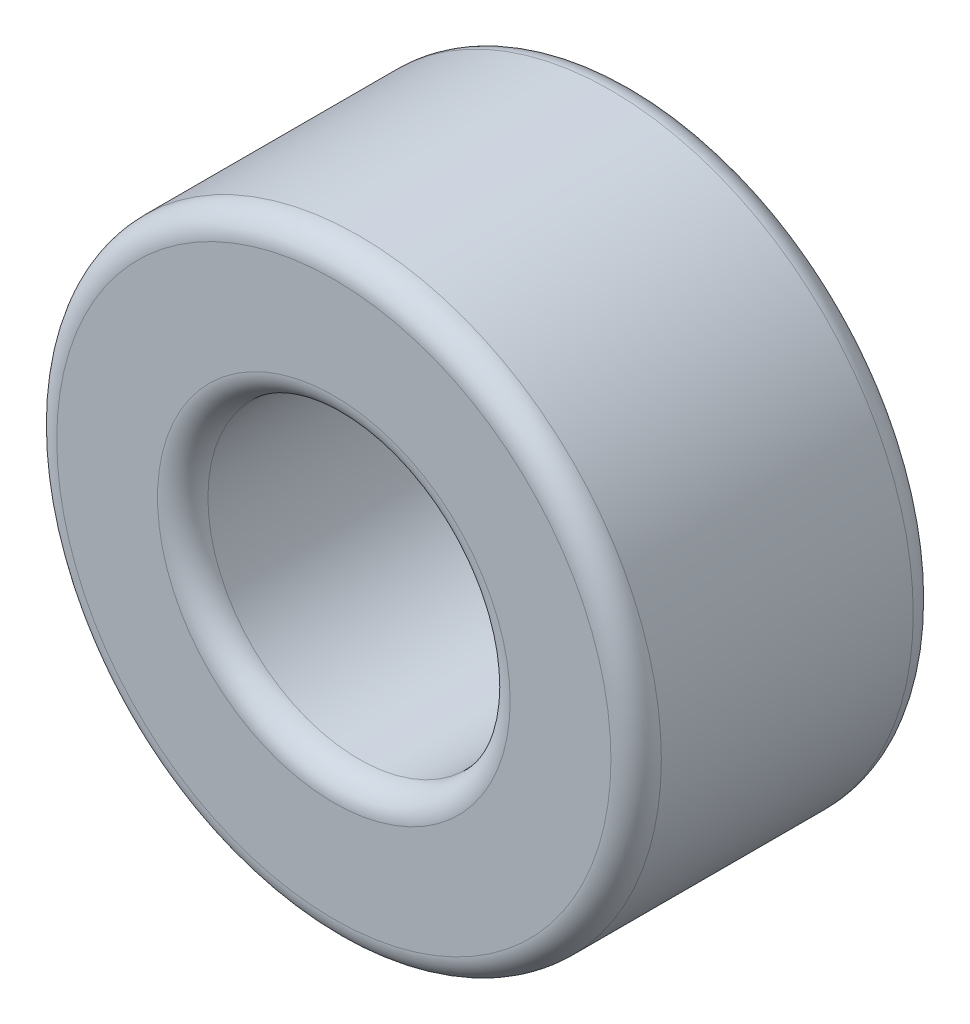
ISO-10303-21;
HEADER;
FILE_DESCRIPTION(('STEP AP214'),'2;1');
FILE_NAME('part.step','',(''),(''),'','','');
FILE_SCHEMA(('AUTOMOTIVE_DESIGN { 1 0 10303 214 1 1 1 1 }'));
ENDSEC;
DATA;
#1=APPLICATION_CONTEXT('core data for automotive mechanical design processes');
#2=APPLICATION_PROTOCOL_DEFINITION('international standard','automotive_design',2000,#1);
#3=PRODUCT_CONTEXT('',#1,'mechanical');
#4=PRODUCT('Part','Part','',(#3));
#5=PRODUCT_RELATED_PRODUCT_CATEGORY('part','',(#4));
#6=PRODUCT_DEFINITION_FORMATION('','',#4);
#7=PRODUCT_DEFINITION_CONTEXT('part definition',#1,'design');
#8=PRODUCT_DEFINITION('design','',#6,#7);
#9=PRODUCT_DEFINITION_SHAPE('','',#8);
#10=(LENGTH_UNIT() NAMED_UNIT(*) SI_UNIT(.MILLI.,.METRE.));
#11=(NAMED_UNIT(*) PLANE_ANGLE_UNIT() SI_UNIT($,.RADIAN.));
#12=(NAMED_UNIT(*) SI_UNIT($,.STERADIAN.) SOLID_ANGLE_UNIT());
#13=UNCERTAINTY_MEASURE_WITH_UNIT(LENGTH_MEASURE(1.E-05),#10,'distance_accuracy_value','');
#14=(GEOMETRIC_REPRESENTATION_CONTEXT(3) GLOBAL_UNCERTAINTY_ASSIGNED_CONTEXT((#13)) GLOBAL_UNIT_ASSIGNED_CONTEXT((#10,
#11,#12)) REPRESENTATION_CONTEXT('',''));
#15=CARTESIAN_POINT('',(0.,0.,0.));
#16=DIRECTION('',(0.,0.,1.));
#17=DIRECTION('',(1.,0.,0.));
#18=AXIS2_PLACEMENT_3D('',#15,#16,#17);
#19=CARTESIAN_POINT('',(0.,0.,6.));
#20=DIRECTION('',(0.,0.,1.));
#21=DIRECTION('',(1.,0.,0.));
#22=AXIS2_PLACEMENT_3D('',#19,#20,#21);
#23=PLANE('',#22);
#24=CARTESIAN_POINT('',(0.,0.,6.));
#25=DIRECTION('',(0.,0.,1.));
#26=DIRECTION('',(1.,0.,0.));
#27=AXIS2_PLACEMENT_3D('',#24,#25,#26);
#28=CIRCLE('',#27,3.5);
#29=CARTESIAN_POINT('',(3.5,0.,6.));
#30=VERTEX_POINT('',#29);
#31=EDGE_CURVE('E10',#30,#30,#28,.F.);
#32=ORIENTED_EDGE('',*,*,#31,.T.);
#33=EDGE_LOOP('',(#32));
#34=FACE_BOUND('',#33,.T.);
#35=CARTESIAN_POINT('',(0.,0.,6.));
#36=DIRECTION('',(0.,0.,1.));
#37=DIRECTION('',(1.,0.,0.));
#38=AXIS2_PLACEMENT_3D('',#35,#36,#37);
#39=CIRCLE('',#38,5.5);
#40=CARTESIAN_POINT('',(5.5,0.,6.));
#41=VERTEX_POINT('',#40);
#42=EDGE_CURVE('E41',#41,#41,#39,.T.);
#43=ORIENTED_EDGE('',*,*,#42,.T.);
#44=EDGE_LOOP('',(#43));
#45=FACE_BOUND('',#44,.T.);
#46=ADVANCED_FACE('F34',(#34,#45),#23,.T.);
#47=CARTESIAN_POINT('',(0.,0.,0.));
#48=DIRECTION('',(0.,0.,1.));
#49=DIRECTION('',(1.,0.,0.));
#50=AXIS2_PLACEMENT_3D('',#47,#48,#49);
#51=PLANE('',#50);
#52=CARTESIAN_POINT('',(0.,0.,0.));
#53=DIRECTION('',(0.,0.,1.));
#54=DIRECTION('',(1.,0.,0.));
#55=AXIS2_PLACEMENT_3D('',#52,#53,#54);
#56=CIRCLE('',#55,5.5);
#57=CARTESIAN_POINT('',(5.5,0.,0.));
#58=VERTEX_POINT('',#57);
#59=EDGE_CURVE('E54',#58,#58,#56,.F.);
#60=ORIENTED_EDGE('',*,*,#59,.T.);
#61=EDGE_LOOP('',(#60));
#62=FACE_BOUND('',#61,.T.);
#63=CARTESIAN_POINT('',(0.,0.,0.));
#64=DIRECTION('',(0.,0.,1.));
#65=DIRECTION('',(1.,0.,0.));
#66=AXIS2_PLACEMENT_3D('',#63,#64,#65);
#67=CIRCLE('',#66,3.5);
#68=CARTESIAN_POINT('',(3.5,0.,0.));
#69=VERTEX_POINT('',#68);
#70=EDGE_CURVE('E57',#69,#69,#67,.T.);
#71=ORIENTED_EDGE('',*,*,#70,.T.);
#72=EDGE_LOOP('',(#71));
#73=FACE_BOUND('',#72,.T.);
#74=ADVANCED_FACE('F78',(#62,#73),#51,.F.);
#75=CARTESIAN_POINT('',(0.,0.,6.));
#76=DIRECTION('',(0.,0.,-1.));
#77=DIRECTION('',(-1.,0.,0.));
#78=AXIS2_PLACEMENT_3D('',#75,#76,#77);
#79=CYLINDRICAL_SURFACE('',#78,6.);
#80=CARTESIAN_POINT('',(0.,0.,0.5));
#81=DIRECTION('',(0.,0.,1.));
#82=DIRECTION('',(1.,0.,0.));
#83=AXIS2_PLACEMENT_3D('',#80,#81,#82);
#84=CIRCLE('',#83,6.);
#85=CARTESIAN_POINT('',(6.,0.,0.5));
#86=VERTEX_POINT('',#85);
#87=EDGE_CURVE('E60',#86,#86,#84,.T.);
#88=ORIENTED_EDGE('',*,*,#87,.T.);
#89=EDGE_LOOP('',(#88));
#90=FACE_BOUND('',#89,.T.);
#91=CARTESIAN_POINT('',(0.,0.,5.5));
#92=DIRECTION('',(0.,0.,1.));
#93=DIRECTION('',(1.,0.,0.));
#94=AXIS2_PLACEMENT_3D('',#91,#92,#93);
#95=CIRCLE('',#94,6.);
#96=CARTESIAN_POINT('',(6.,0.,5.5));
#97=VERTEX_POINT('',#96);
#98=EDGE_CURVE('E63',#97,#97,#95,.F.);
#99=ORIENTED_EDGE('',*,*,#98,.T.);
#100=EDGE_LOOP('',(#99));
#101=FACE_BOUND('',#100,.T.);
#102=ADVANCED_FACE('F67',(#90,#101),#79,.T.);
#103=CARTESIAN_POINT('',(0.,0.,6.));
#104=DIRECTION('',(0.,0.,-1.));
#105=DIRECTION('',(-1.,0.,0.));
#106=AXIS2_PLACEMENT_3D('',#103,#104,#105);
#107=CYLINDRICAL_SURFACE('',#106,3.);
#108=CARTESIAN_POINT('',(0.,0.,0.5));
#109=DIRECTION('',(0.,0.,1.));
#110=DIRECTION('',(1.,0.,0.));
#111=AXIS2_PLACEMENT_3D('',#108,#109,#110);
#112=CIRCLE('',#111,3.);
#113=CARTESIAN_POINT('',(3.,0.,0.5));
#114=VERTEX_POINT('',#113);
#115=EDGE_CURVE('E45',#114,#114,#112,.F.);
#116=ORIENTED_EDGE('',*,*,#115,.T.);
#117=EDGE_LOOP('',(#116));
#118=FACE_BOUND('',#117,.T.);
#119=CARTESIAN_POINT('',(0.,0.,5.5));
#120=DIRECTION('',(0.,0.,1.));
#121=DIRECTION('',(1.,0.,0.));
#122=AXIS2_PLACEMENT_3D('',#119,#120,#121);
#123=CIRCLE('',#122,3.);
#124=CARTESIAN_POINT('',(3.,0.,5.5));
#125=VERTEX_POINT('',#124);
#126=EDGE_CURVE('E49',#125,#125,#123,.T.);
#127=ORIENTED_EDGE('',*,*,#126,.T.);
#128=EDGE_LOOP('',(#127));
#129=FACE_BOUND('',#128,.T.);
#130=ADVANCED_FACE('F86',(#118,#129),#107,.F.);
#131=CARTESIAN_POINT('',(0.,0.,0.5));
#132=DIRECTION('',(0.,0.,1.));
#133=DIRECTION('',(1.,0.,0.));
#134=AXIS2_PLACEMENT_3D('',#131,#132,#133);
#135=TOROIDAL_SURFACE('',#134,5.5,0.5);
#136=ORIENTED_EDGE('',*,*,#59,.F.);
#137=EDGE_LOOP('',(#136));
#138=FACE_BOUND('',#137,.T.);
#139=ORIENTED_EDGE('',*,*,#87,.F.);
#140=EDGE_LOOP('',(#139));
#141=FACE_BOUND('',#140,.T.);
#142=ADVANCED_FACE('F91',(#138,#141),#135,.T.);
#143=CARTESIAN_POINT('',(0.,0.,0.5));
#144=DIRECTION('',(0.,0.,1.));
#145=DIRECTION('',(1.,0.,0.));
#146=AXIS2_PLACEMENT_3D('',#143,#144,#145);
#147=TOROIDAL_SURFACE('',#146,3.5,0.5);
#148=ORIENTED_EDGE('',*,*,#115,.F.);
#149=EDGE_LOOP('',(#148));
#150=FACE_BOUND('',#149,.T.);
#151=ORIENTED_EDGE('',*,*,#70,.F.);
#152=EDGE_LOOP('',(#151));
#153=FACE_BOUND('',#152,.T.);
#154=ADVANCED_FACE('F75',(#150,#153),#147,.T.);
#155=CARTESIAN_POINT('',(0.,0.,5.5));
#156=DIRECTION('',(0.,0.,1.));
#157=DIRECTION('',(1.,0.,0.));
#158=AXIS2_PLACEMENT_3D('',#155,#156,#157);
#159=TOROIDAL_SURFACE('',#158,3.5,0.5);
#160=ORIENTED_EDGE('',*,*,#31,.F.);
#161=EDGE_LOOP('',(#160));
#162=FACE_BOUND('',#161,.T.);
#163=ORIENTED_EDGE('',*,*,#126,.F.);
#164=EDGE_LOOP('',(#163));
#165=FACE_BOUND('',#164,.T.);
#166=ADVANCED_FACE('F71',(#162,#165),#159,.T.);
#167=CARTESIAN_POINT('',(0.,0.,5.5));
#168=DIRECTION('',(0.,0.,1.));
#169=DIRECTION('',(1.,0.,0.));
#170=AXIS2_PLACEMENT_3D('',#167,#168,#169);
#171=TOROIDAL_SURFACE('',#170,5.5,0.5);
#172=ORIENTED_EDGE('',*,*,#98,.F.);
#173=EDGE_LOOP('',(#172));
#174=FACE_BOUND('',#173,.T.);
#175=ORIENTED_EDGE('',*,*,#42,.F.);
#176=EDGE_LOOP('',(#175));
#177=FACE_BOUND('',#176,.T.);
#178=ADVANCED_FACE('F36',(#174,#177),#171,.T.);
#179=CLOSED_SHELL('',(#46,#74,#102,#130,#142,#154,#166,#178));
#180=MANIFOLD_SOLID_BREP('B2',#179);
#181=ADVANCED_BREP_SHAPE_REPRESENTATION('',(#18,#180),#14);
#182=SHAPE_DEFINITION_REPRESENTATION(#9,#181);
ENDSEC;
END-ISO-10303-21;
